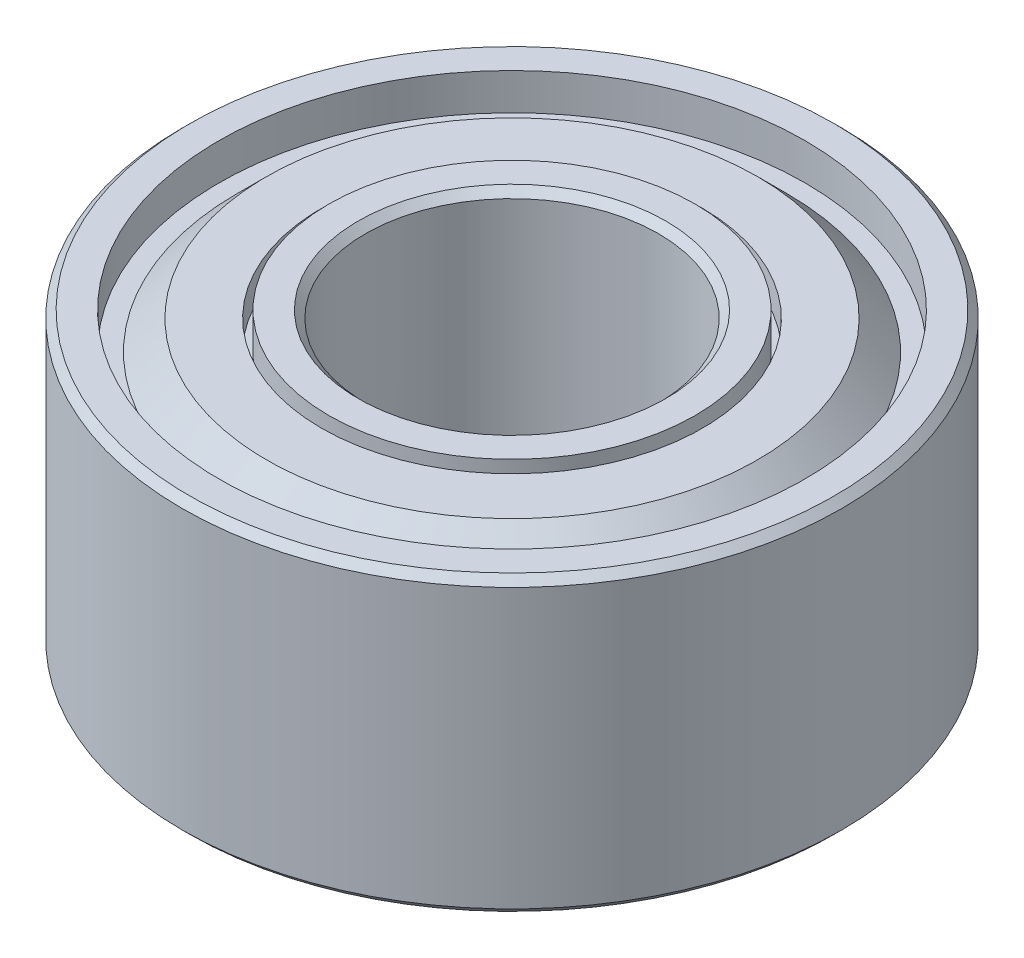
ISO-10303-21;
HEADER;
FILE_DESCRIPTION(('STEP AP214'),'2;1');
FILE_NAME('part.step','',(''),(''),'','','');
FILE_SCHEMA(('AUTOMOTIVE_DESIGN { 1 0 10303 214 1 1 1 1 }'));
ENDSEC;
DATA;
#1=APPLICATION_CONTEXT('core data for automotive mechanical design processes');
#2=APPLICATION_PROTOCOL_DEFINITION('international standard','automotive_design',2000,#1);
#3=PRODUCT_CONTEXT('',#1,'mechanical');
#4=PRODUCT('Part','Part','',(#3));
#5=PRODUCT_RELATED_PRODUCT_CATEGORY('part','',(#4));
#6=PRODUCT_DEFINITION_FORMATION('','',#4);
#7=PRODUCT_DEFINITION_CONTEXT('part definition',#1,'design');
#8=PRODUCT_DEFINITION('design','',#6,#7);
#9=PRODUCT_DEFINITION_SHAPE('','',#8);
#10=(LENGTH_UNIT() NAMED_UNIT(*) SI_UNIT(.MILLI.,.METRE.));
#11=(NAMED_UNIT(*) PLANE_ANGLE_UNIT() SI_UNIT($,.RADIAN.));
#12=(NAMED_UNIT(*) SI_UNIT($,.STERADIAN.) SOLID_ANGLE_UNIT());
#13=UNCERTAINTY_MEASURE_WITH_UNIT(LENGTH_MEASURE(1.E-05),#10,'distance_accuracy_value','');
#14=(GEOMETRIC_REPRESENTATION_CONTEXT(3) GLOBAL_UNCERTAINTY_ASSIGNED_CONTEXT((#13)) GLOBAL_UNIT_ASSIGNED_CONTEXT((#10,
#11,#12)) REPRESENTATION_CONTEXT('',''));
#15=CARTESIAN_POINT('',(0.,0.,0.));
#16=DIRECTION('',(0.,0.,1.));
#17=DIRECTION('',(1.,0.,0.));
#18=AXIS2_PLACEMENT_3D('',#15,#16,#17);
#19=CARTESIAN_POINT('',(0.,2.,2.5));
#20=DIRECTION('',(0.,-1.,0.));
#21=DIRECTION('',(0.,0.,-1.));
#22=AXIS2_PLACEMENT_3D('',#19,#20,#21);
#23=PLANE('',#22);
#24=CARTESIAN_POINT('',(0.,2.,0.));
#25=DIRECTION('',(0.,-1.,0.));
#26=DIRECTION('',(0.,0.,-1.));
#27=AXIS2_PLACEMENT_3D('',#24,#25,#26);
#28=CIRCLE('',#27,2.1);
#29=CARTESIAN_POINT('',(0.,2.,-2.1));
#30=VERTEX_POINT('',#29);
#31=EDGE_CURVE('E54',#30,#30,#28,.T.);
#32=ORIENTED_EDGE('',*,*,#31,.T.);
#33=EDGE_LOOP('',(#32));
#34=FACE_BOUND('',#33,.T.);
#35=CARTESIAN_POINT('',(0.,2.,0.));
#36=DIRECTION('',(0.,-1.,0.));
#37=DIRECTION('',(0.,0.,-1.));
#38=AXIS2_PLACEMENT_3D('',#35,#36,#37);
#39=CIRCLE('',#38,2.5);
#40=CARTESIAN_POINT('',(0.,2.,-2.5));
#41=VERTEX_POINT('',#40);
#42=EDGE_CURVE('E111',#41,#41,#39,.T.);
#43=ORIENTED_EDGE('',*,*,#42,.F.);
#44=EDGE_LOOP('',(#43));
#45=FACE_BOUND('',#44,.T.);
#46=ADVANCED_FACE('F33',(#34,#45),#23,.F.);
#47=CARTESIAN_POINT('',(0.,-2.,0.));
#48=DIRECTION('',(0.,-1.,0.));
#49=DIRECTION('',(0.,0.,-1.));
#50=AXIS2_PLACEMENT_3D('',#47,#48,#49);
#51=CYLINDRICAL_SURFACE('',#50,2.);
#52=CARTESIAN_POINT('',(0.,-1.9,0.));
#53=DIRECTION('',(0.,1.,0.));
#54=DIRECTION('',(0.,0.,1.));
#55=AXIS2_PLACEMENT_3D('',#52,#53,#54);
#56=CIRCLE('',#55,2.);
#57=CARTESIAN_POINT('',(0.,-1.9,2.));
#58=VERTEX_POINT('',#57);
#59=EDGE_CURVE('E60',#58,#58,#56,.F.);
#60=ORIENTED_EDGE('',*,*,#59,.T.);
#61=EDGE_LOOP('',(#60));
#62=FACE_BOUND('',#61,.T.);
#63=CARTESIAN_POINT('',(0.,1.9,0.));
#64=DIRECTION('',(0.,-1.,0.));
#65=DIRECTION('',(0.,0.,-1.));
#66=AXIS2_PLACEMENT_3D('',#63,#64,#65);
#67=CIRCLE('',#66,2.);
#68=CARTESIAN_POINT('',(0.,1.9,-2.));
#69=VERTEX_POINT('',#68);
#70=EDGE_CURVE('E63',#69,#69,#67,.F.);
#71=ORIENTED_EDGE('',*,*,#70,.T.);
#72=EDGE_LOOP('',(#71));
#73=FACE_BOUND('',#72,.T.);
#74=ADVANCED_FACE('F118',(#62,#73),#51,.F.);
#75=CARTESIAN_POINT('',(0.,-2.,2.5));
#76=DIRECTION('',(0.,1.,0.));
#77=DIRECTION('',(0.,0.,1.));
#78=AXIS2_PLACEMENT_3D('',#75,#76,#77);
#79=PLANE('',#78);
#80=CARTESIAN_POINT('',(0.,-2.,0.));
#81=DIRECTION('',(0.,1.,0.));
#82=DIRECTION('',(0.,0.,1.));
#83=AXIS2_PLACEMENT_3D('',#80,#81,#82);
#84=CIRCLE('',#83,2.1);
#85=CARTESIAN_POINT('',(0.,-2.,2.1));
#86=VERTEX_POINT('',#85);
#87=EDGE_CURVE('E57',#86,#86,#84,.T.);
#88=ORIENTED_EDGE('',*,*,#87,.T.);
#89=EDGE_LOOP('',(#88));
#90=FACE_BOUND('',#89,.T.);
#91=CARTESIAN_POINT('',(0.,-2.,0.));
#92=DIRECTION('',(0.,-1.,0.));
#93=DIRECTION('',(0.,0.,-1.));
#94=AXIS2_PLACEMENT_3D('',#91,#92,#93);
#95=CIRCLE('',#94,2.5);
#96=CARTESIAN_POINT('',(0.,-2.,-2.5));
#97=VERTEX_POINT('',#96);
#98=EDGE_CURVE('E66',#97,#97,#95,.T.);
#99=ORIENTED_EDGE('',*,*,#98,.T.);
#100=EDGE_LOOP('',(#99));
#101=FACE_BOUND('',#100,.T.);
#102=ADVANCED_FACE('F124',(#90,#101),#79,.F.);
#103=CARTESIAN_POINT('',(0.,-2.,0.));
#104=DIRECTION('',(0.,-1.,0.));
#105=DIRECTION('',(0.,0.,-1.));
#106=AXIS2_PLACEMENT_3D('',#103,#104,#105);
#107=CYLINDRICAL_SURFACE('',#106,2.5);
#108=ORIENTED_EDGE('',*,*,#98,.F.);
#109=EDGE_LOOP('',(#108));
#110=FACE_BOUND('',#109,.T.);
#111=CARTESIAN_POINT('',(0.,-1.5,0.));
#112=DIRECTION('',(0.,-1.,0.));
#113=DIRECTION('',(0.,0.,-1.));
#114=AXIS2_PLACEMENT_3D('',#111,#112,#113);
#115=CIRCLE('',#114,2.5);
#116=CARTESIAN_POINT('',(0.,-1.5,-2.5));
#117=VERTEX_POINT('',#116);
#118=EDGE_CURVE('E69',#117,#117,#115,.T.);
#119=ORIENTED_EDGE('',*,*,#118,.T.);
#120=EDGE_LOOP('',(#119));
#121=FACE_BOUND('',#120,.T.);
#122=ADVANCED_FACE('F190',(#110,#121),#107,.T.);
#123=CARTESIAN_POINT('',(0.,-1.5,2.6));
#124=DIRECTION('',(0.,1.,0.));
#125=DIRECTION('',(0.,0.,1.));
#126=AXIS2_PLACEMENT_3D('',#123,#124,#125);
#127=PLANE('',#126);
#128=ORIENTED_EDGE('',*,*,#118,.F.);
#129=EDGE_LOOP('',(#128));
#130=FACE_BOUND('',#129,.T.);
#131=CARTESIAN_POINT('',(0.,-1.5,0.));
#132=DIRECTION('',(0.,-1.,0.));
#133=DIRECTION('',(0.,0.,-1.));
#134=AXIS2_PLACEMENT_3D('',#131,#132,#133);
#135=CIRCLE('',#134,2.6);
#136=CARTESIAN_POINT('',(0.,-1.5,-2.6));
#137=VERTEX_POINT('',#136);
#138=EDGE_CURVE('E72',#137,#137,#135,.T.);
#139=ORIENTED_EDGE('',*,*,#138,.T.);
#140=EDGE_LOOP('',(#139));
#141=FACE_BOUND('',#140,.T.);
#142=ADVANCED_FACE('F186',(#130,#141),#127,.F.);
#143=CARTESIAN_POINT('',(0.,-2.,0.));
#144=DIRECTION('',(0.,-1.,0.));
#145=DIRECTION('',(0.,0.,-1.));
#146=AXIS2_PLACEMENT_3D('',#143,#144,#145);
#147=CYLINDRICAL_SURFACE('',#146,2.6);
#148=ORIENTED_EDGE('',*,*,#138,.F.);
#149=EDGE_LOOP('',(#148));
#150=FACE_BOUND('',#149,.T.);
#151=CARTESIAN_POINT('',(0.,-1.9,0.));
#152=DIRECTION('',(0.,-1.,0.));
#153=DIRECTION('',(0.,0.,-1.));
#154=AXIS2_PLACEMENT_3D('',#151,#152,#153);
#155=CIRCLE('',#154,2.6);
#156=CARTESIAN_POINT('',(0.,-1.9,-2.6));
#157=VERTEX_POINT('',#156);
#158=EDGE_CURVE('E75',#157,#157,#155,.T.);
#159=ORIENTED_EDGE('',*,*,#158,.T.);
#160=EDGE_LOOP('',(#159));
#161=FACE_BOUND('',#160,.T.);
#162=ADVANCED_FACE('F182',(#150,#161),#147,.F.);
#163=CARTESIAN_POINT('',(0.,-1.9,3.35));
#164=DIRECTION('',(0.,1.,0.));
#165=DIRECTION('',(0.,0.,1.));
#166=AXIS2_PLACEMENT_3D('',#163,#164,#165);
#167=PLANE('',#166);
#168=ORIENTED_EDGE('',*,*,#158,.F.);
#169=EDGE_LOOP('',(#168));
#170=FACE_BOUND('',#169,.T.);
#171=CARTESIAN_POINT('',(0.,-1.9,0.));
#172=DIRECTION('',(0.,-1.,0.));
#173=DIRECTION('',(0.,0.,-1.));
#174=AXIS2_PLACEMENT_3D('',#171,#172,#173);
#175=CIRCLE('',#174,3.35);
#176=CARTESIAN_POINT('',(0.,-1.9,-3.35));
#177=VERTEX_POINT('',#176);
#178=EDGE_CURVE('E78',#177,#177,#175,.T.);
#179=ORIENTED_EDGE('',*,*,#178,.T.);
#180=EDGE_LOOP('',(#179));
#181=FACE_BOUND('',#180,.T.);
#182=ADVANCED_FACE('F178',(#170,#181),#167,.F.);
#183=CARTESIAN_POINT('',(0.,-1.5,0.));
#184=DIRECTION('',(0.,1.,0.));
#185=DIRECTION('',(0.,0.,1.));
#186=AXIS2_PLACEMENT_3D('',#183,#184,#185);
#187=CONICAL_SURFACE('',#186,3.75,0.785398163397443);
#188=ORIENTED_EDGE('',*,*,#178,.F.);
#189=EDGE_LOOP('',(#188));
#190=FACE_BOUND('',#189,.T.);
#191=CARTESIAN_POINT('',(0.,-1.5,0.));
#192=DIRECTION('',(0.,-1.,0.));
#193=DIRECTION('',(0.,0.,-1.));
#194=AXIS2_PLACEMENT_3D('',#191,#192,#193);
#195=CIRCLE('',#194,3.75);
#196=CARTESIAN_POINT('',(0.,-1.5,-3.75));
#197=VERTEX_POINT('',#196);
#198=EDGE_CURVE('E81',#197,#197,#195,.T.);
#199=ORIENTED_EDGE('',*,*,#198,.T.);
#200=EDGE_LOOP('',(#199));
#201=FACE_BOUND('',#200,.T.);
#202=ADVANCED_FACE('F170',(#190,#201),#187,.T.);
#203=CARTESIAN_POINT('',(0.,-1.5,4.));
#204=DIRECTION('',(0.,1.,0.));
#205=DIRECTION('',(0.,0.,1.));
#206=AXIS2_PLACEMENT_3D('',#203,#204,#205);
#207=PLANE('',#206);
#208=ORIENTED_EDGE('',*,*,#198,.F.);
#209=EDGE_LOOP('',(#208));
#210=FACE_BOUND('',#209,.T.);
#211=CARTESIAN_POINT('',(0.,-1.5,0.));
#212=DIRECTION('',(0.,-1.,0.));
#213=DIRECTION('',(0.,0.,-1.));
#214=AXIS2_PLACEMENT_3D('',#211,#212,#213);
#215=CIRCLE('',#214,4.);
#216=CARTESIAN_POINT('',(0.,-1.5,-4.));
#217=VERTEX_POINT('',#216);
#218=EDGE_CURVE('E84',#217,#217,#215,.T.);
#219=ORIENTED_EDGE('',*,*,#218,.T.);
#220=EDGE_LOOP('',(#219));
#221=FACE_BOUND('',#220,.T.);
#222=ADVANCED_FACE('F164',(#210,#221),#207,.F.);
#223=CARTESIAN_POINT('',(0.,-2.,0.));
#224=DIRECTION('',(0.,-1.,0.));
#225=DIRECTION('',(0.,0.,-1.));
#226=AXIS2_PLACEMENT_3D('',#223,#224,#225);
#227=CYLINDRICAL_SURFACE('',#226,4.);
#228=ORIENTED_EDGE('',*,*,#218,.F.);
#229=EDGE_LOOP('',(#228));
#230=FACE_BOUND('',#229,.T.);
#231=CARTESIAN_POINT('',(0.,-2.,0.));
#232=DIRECTION('',(0.,-1.,0.));
#233=DIRECTION('',(0.,0.,-1.));
#234=AXIS2_PLACEMENT_3D('',#231,#232,#233);
#235=CIRCLE('',#234,4.);
#236=CARTESIAN_POINT('',(0.,-2.,-4.));
#237=VERTEX_POINT('',#236);
#238=EDGE_CURVE('E87',#237,#237,#235,.T.);
#239=ORIENTED_EDGE('',*,*,#238,.T.);
#240=EDGE_LOOP('',(#239));
#241=FACE_BOUND('',#240,.T.);
#242=ADVANCED_FACE('F159',(#230,#241),#227,.F.);
#243=CARTESIAN_POINT('',(0.,-2.,4.5));
#244=DIRECTION('',(0.,1.,0.));
#245=DIRECTION('',(0.,0.,1.));
#246=AXIS2_PLACEMENT_3D('',#243,#244,#245);
#247=PLANE('',#246);
#248=CARTESIAN_POINT('',(0.,-2.,0.));
#249=DIRECTION('',(0.,1.,0.));
#250=DIRECTION('',(0.,0.,1.));
#251=AXIS2_PLACEMENT_3D('',#248,#249,#250);
#252=CIRCLE('',#251,4.4);
#253=CARTESIAN_POINT('',(0.,-2.,4.4));
#254=VERTEX_POINT('',#253);
#255=EDGE_CURVE('E49',#254,#254,#252,.F.);
#256=ORIENTED_EDGE('',*,*,#255,.T.);
#257=EDGE_LOOP('',(#256));
#258=FACE_BOUND('',#257,.T.);
#259=ORIENTED_EDGE('',*,*,#238,.F.);
#260=EDGE_LOOP('',(#259));
#261=FACE_BOUND('',#260,.T.);
#262=ADVANCED_FACE('F155',(#258,#261),#247,.F.);
#263=CARTESIAN_POINT('',(0.,-2.,0.));
#264=DIRECTION('',(0.,-1.,0.));
#265=DIRECTION('',(0.,0.,-1.));
#266=AXIS2_PLACEMENT_3D('',#263,#264,#265);
#267=CYLINDRICAL_SURFACE('',#266,4.5);
#268=CARTESIAN_POINT('',(0.,-1.9,0.));
#269=DIRECTION('',(0.,1.,0.));
#270=DIRECTION('',(0.,0.,1.));
#271=AXIS2_PLACEMENT_3D('',#268,#269,#270);
#272=CIRCLE('',#271,4.5);
#273=CARTESIAN_POINT('',(0.,-1.9,4.5));
#274=VERTEX_POINT('',#273);
#275=EDGE_CURVE('E41',#274,#274,#272,.T.);
#276=ORIENTED_EDGE('',*,*,#275,.T.);
#277=EDGE_LOOP('',(#276));
#278=FACE_BOUND('',#277,.T.);
#279=CARTESIAN_POINT('',(0.,1.9,0.));
#280=DIRECTION('',(0.,-1.,0.));
#281=DIRECTION('',(0.,0.,-1.));
#282=AXIS2_PLACEMENT_3D('',#279,#280,#281);
#283=CIRCLE('',#282,4.5);
#284=CARTESIAN_POINT('',(0.,1.9,-4.5));
#285=VERTEX_POINT('',#284);
#286=EDGE_CURVE('E45',#285,#285,#283,.T.);
#287=ORIENTED_EDGE('',*,*,#286,.T.);
#288=EDGE_LOOP('',(#287));
#289=FACE_BOUND('',#288,.T.);
#290=ADVANCED_FACE('F158',(#278,#289),#267,.T.);
#291=CARTESIAN_POINT('',(0.,2.,4.5));
#292=DIRECTION('',(0.,-1.,0.));
#293=DIRECTION('',(0.,0.,-1.));
#294=AXIS2_PLACEMENT_3D('',#291,#292,#293);
#295=PLANE('',#294);
#296=CARTESIAN_POINT('',(0.,2.,0.));
#297=DIRECTION('',(0.,-1.,0.));
#298=DIRECTION('',(0.,0.,-1.));
#299=AXIS2_PLACEMENT_3D('',#296,#297,#298);
#300=CIRCLE('',#299,4.4);
#301=CARTESIAN_POINT('',(0.,2.,-4.4));
#302=VERTEX_POINT('',#301);
#303=EDGE_CURVE('E10',#302,#302,#300,.F.);
#304=ORIENTED_EDGE('',*,*,#303,.T.);
#305=EDGE_LOOP('',(#304));
#306=FACE_BOUND('',#305,.T.);
#307=CARTESIAN_POINT('',(0.,2.,0.));
#308=DIRECTION('',(0.,-1.,0.));
#309=DIRECTION('',(0.,0.,-1.));
#310=AXIS2_PLACEMENT_3D('',#307,#308,#309);
#311=CIRCLE('',#310,4.);
#312=CARTESIAN_POINT('',(0.,2.,-4.));
#313=VERTEX_POINT('',#312);
#314=EDGE_CURVE('E90',#313,#313,#311,.T.);
#315=ORIENTED_EDGE('',*,*,#314,.T.);
#316=EDGE_LOOP('',(#315));
#317=FACE_BOUND('',#316,.T.);
#318=ADVANCED_FACE('F261',(#306,#317),#295,.F.);
#319=CARTESIAN_POINT('',(0.,-2.,0.));
#320=DIRECTION('',(0.,-1.,0.));
#321=DIRECTION('',(0.,0.,-1.));
#322=AXIS2_PLACEMENT_3D('',#319,#320,#321);
#323=CYLINDRICAL_SURFACE('',#322,4.);
#324=ORIENTED_EDGE('',*,*,#314,.F.);
#325=EDGE_LOOP('',(#324));
#326=FACE_BOUND('',#325,.T.);
#327=CARTESIAN_POINT('',(0.,1.5,0.));
#328=DIRECTION('',(0.,-1.,0.));
#329=DIRECTION('',(0.,0.,-1.));
#330=AXIS2_PLACEMENT_3D('',#327,#328,#329);
#331=CIRCLE('',#330,4.);
#332=CARTESIAN_POINT('',(0.,1.5,-4.));
#333=VERTEX_POINT('',#332);
#334=EDGE_CURVE('E93',#333,#333,#331,.T.);
#335=ORIENTED_EDGE('',*,*,#334,.T.);
#336=EDGE_LOOP('',(#335));
#337=FACE_BOUND('',#336,.T.);
#338=ADVANCED_FACE('F255',(#326,#337),#323,.F.);
#339=CARTESIAN_POINT('',(0.,1.5,4.));
#340=DIRECTION('',(0.,-1.,0.));
#341=DIRECTION('',(0.,0.,-1.));
#342=AXIS2_PLACEMENT_3D('',#339,#340,#341);
#343=PLANE('',#342);
#344=ORIENTED_EDGE('',*,*,#334,.F.);
#345=EDGE_LOOP('',(#344));
#346=FACE_BOUND('',#345,.T.);
#347=CARTESIAN_POINT('',(0.,1.5,0.));
#348=DIRECTION('',(0.,-1.,0.));
#349=DIRECTION('',(0.,0.,-1.));
#350=AXIS2_PLACEMENT_3D('',#347,#348,#349);
#351=CIRCLE('',#350,3.75);
#352=CARTESIAN_POINT('',(0.,1.5,-3.75));
#353=VERTEX_POINT('',#352);
#354=EDGE_CURVE('E96',#353,#353,#351,.T.);
#355=ORIENTED_EDGE('',*,*,#354,.T.);
#356=EDGE_LOOP('',(#355));
#357=FACE_BOUND('',#356,.T.);
#358=ADVANCED_FACE('F260',(#346,#357),#343,.F.);
#359=CARTESIAN_POINT('',(0.,1.9,0.));
#360=DIRECTION('',(0.,-1.,0.));
#361=DIRECTION('',(0.,0.,-1.));
#362=AXIS2_PLACEMENT_3D('',#359,#360,#361);
#363=CONICAL_SURFACE('',#362,3.35,0.785398163397442);
#364=ORIENTED_EDGE('',*,*,#354,.F.);
#365=EDGE_LOOP('',(#364));
#366=FACE_BOUND('',#365,.T.);
#367=CARTESIAN_POINT('',(0.,1.9,0.));
#368=DIRECTION('',(0.,-1.,0.));
#369=DIRECTION('',(0.,0.,-1.));
#370=AXIS2_PLACEMENT_3D('',#367,#368,#369);
#371=CIRCLE('',#370,3.35);
#372=CARTESIAN_POINT('',(0.,1.9,-3.35));
#373=VERTEX_POINT('',#372);
#374=EDGE_CURVE('E99',#373,#373,#371,.T.);
#375=ORIENTED_EDGE('',*,*,#374,.T.);
#376=EDGE_LOOP('',(#375));
#377=FACE_BOUND('',#376,.T.);
#378=ADVANCED_FACE('F273',(#366,#377),#363,.T.);
#379=CARTESIAN_POINT('',(0.,1.9,3.35));
#380=DIRECTION('',(0.,-1.,0.));
#381=DIRECTION('',(0.,0.,-1.));
#382=AXIS2_PLACEMENT_3D('',#379,#380,#381);
#383=PLANE('',#382);
#384=ORIENTED_EDGE('',*,*,#374,.F.);
#385=EDGE_LOOP('',(#384));
#386=FACE_BOUND('',#385,.T.);
#387=CARTESIAN_POINT('',(0.,1.9,0.));
#388=DIRECTION('',(0.,-1.,0.));
#389=DIRECTION('',(0.,0.,-1.));
#390=AXIS2_PLACEMENT_3D('',#387,#388,#389);
#391=CIRCLE('',#390,2.6);
#392=CARTESIAN_POINT('',(0.,1.9,-2.6));
#393=VERTEX_POINT('',#392);
#394=EDGE_CURVE('E102',#393,#393,#391,.T.);
#395=ORIENTED_EDGE('',*,*,#394,.T.);
#396=EDGE_LOOP('',(#395));
#397=FACE_BOUND('',#396,.T.);
#398=ADVANCED_FACE('F283',(#386,#397),#383,.F.);
#399=CARTESIAN_POINT('',(0.,-2.,0.));
#400=DIRECTION('',(0.,-1.,0.));
#401=DIRECTION('',(0.,0.,-1.));
#402=AXIS2_PLACEMENT_3D('',#399,#400,#401);
#403=CYLINDRICAL_SURFACE('',#402,2.6);
#404=ORIENTED_EDGE('',*,*,#394,.F.);
#405=EDGE_LOOP('',(#404));
#406=FACE_BOUND('',#405,.T.);
#407=CARTESIAN_POINT('',(0.,1.5,0.));
#408=DIRECTION('',(0.,-1.,0.));
#409=DIRECTION('',(0.,0.,-1.));
#410=AXIS2_PLACEMENT_3D('',#407,#408,#409);
#411=CIRCLE('',#410,2.6);
#412=CARTESIAN_POINT('',(0.,1.5,-2.6));
#413=VERTEX_POINT('',#412);
#414=EDGE_CURVE('E105',#413,#413,#411,.T.);
#415=ORIENTED_EDGE('',*,*,#414,.T.);
#416=EDGE_LOOP('',(#415));
#417=FACE_BOUND('',#416,.T.);
#418=ADVANCED_FACE('F293',(#406,#417),#403,.F.);
#419=CARTESIAN_POINT('',(0.,1.5,2.6));
#420=DIRECTION('',(0.,-1.,0.));
#421=DIRECTION('',(0.,0.,-1.));
#422=AXIS2_PLACEMENT_3D('',#419,#420,#421);
#423=PLANE('',#422);
#424=ORIENTED_EDGE('',*,*,#414,.F.);
#425=EDGE_LOOP('',(#424));
#426=FACE_BOUND('',#425,.T.);
#427=CARTESIAN_POINT('',(0.,1.5,0.));
#428=DIRECTION('',(0.,-1.,0.));
#429=DIRECTION('',(0.,0.,-1.));
#430=AXIS2_PLACEMENT_3D('',#427,#428,#429);
#431=CIRCLE('',#430,2.5);
#432=CARTESIAN_POINT('',(0.,1.5,-2.5));
#433=VERTEX_POINT('',#432);
#434=EDGE_CURVE('E108',#433,#433,#431,.T.);
#435=ORIENTED_EDGE('',*,*,#434,.T.);
#436=EDGE_LOOP('',(#435));
#437=FACE_BOUND('',#436,.T.);
#438=ADVANCED_FACE('F303',(#426,#437),#423,.F.);
#439=CARTESIAN_POINT('',(0.,-2.,0.));
#440=DIRECTION('',(0.,-1.,0.));
#441=DIRECTION('',(0.,0.,-1.));
#442=AXIS2_PLACEMENT_3D('',#439,#440,#441);
#443=CYLINDRICAL_SURFACE('',#442,2.5);
#444=ORIENTED_EDGE('',*,*,#434,.F.);
#445=EDGE_LOOP('',(#444));
#446=FACE_BOUND('',#445,.T.);
#447=ORIENTED_EDGE('',*,*,#42,.T.);
#448=EDGE_LOOP('',(#447));
#449=FACE_BOUND('',#448,.T.);
#450=ADVANCED_FACE('F115',(#446,#449),#443,.T.);
#451=CARTESIAN_POINT('',(0.,-1.9,0.));
#452=DIRECTION('',(0.,-1.,0.));
#453=DIRECTION('',(0.,0.,-1.));
#454=AXIS2_PLACEMENT_3D('',#451,#452,#453);
#455=CONICAL_SURFACE('',#454,2.,0.785398163397456);
#456=ORIENTED_EDGE('',*,*,#87,.F.);
#457=EDGE_LOOP('',(#456));
#458=FACE_BOUND('',#457,.T.);
#459=ORIENTED_EDGE('',*,*,#59,.F.);
#460=EDGE_LOOP('',(#459));
#461=FACE_BOUND('',#460,.T.);
#462=ADVANCED_FACE('F130',(#458,#461),#455,.F.);
#463=CARTESIAN_POINT('',(0.,2.,0.));
#464=DIRECTION('',(0.,1.,0.));
#465=DIRECTION('',(0.,0.,1.));
#466=AXIS2_PLACEMENT_3D('',#463,#464,#465);
#467=CONICAL_SURFACE('',#466,2.1,0.785398163397446);
#468=ORIENTED_EDGE('',*,*,#70,.F.);
#469=EDGE_LOOP('',(#468));
#470=FACE_BOUND('',#469,.T.);
#471=ORIENTED_EDGE('',*,*,#31,.F.);
#472=EDGE_LOOP('',(#471));
#473=FACE_BOUND('',#472,.T.);
#474=ADVANCED_FACE('F136',(#470,#473),#467,.F.);
#475=CARTESIAN_POINT('',(0.,-2.,0.));
#476=DIRECTION('',(0.,1.,0.));
#477=DIRECTION('',(0.,0.,1.));
#478=AXIS2_PLACEMENT_3D('',#475,#476,#477);
#479=CONICAL_SURFACE('',#478,4.4,0.785398163397447);
#480=ORIENTED_EDGE('',*,*,#275,.F.);
#481=EDGE_LOOP('',(#480));
#482=FACE_BOUND('',#481,.T.);
#483=ORIENTED_EDGE('',*,*,#255,.F.);
#484=EDGE_LOOP('',(#483));
#485=FACE_BOUND('',#484,.T.);
#486=ADVANCED_FACE('F142',(#482,#485),#479,.T.);
#487=CARTESIAN_POINT('',(0.,1.9,0.));
#488=DIRECTION('',(0.,-1.,0.));
#489=DIRECTION('',(0.,0.,-1.));
#490=AXIS2_PLACEMENT_3D('',#487,#488,#489);
#491=CONICAL_SURFACE('',#490,4.5,0.785398163397444);
#492=ORIENTED_EDGE('',*,*,#303,.F.);
#493=EDGE_LOOP('',(#492));
#494=FACE_BOUND('',#493,.T.);
#495=ORIENTED_EDGE('',*,*,#286,.F.);
#496=EDGE_LOOP('',(#495));
#497=FACE_BOUND('',#496,.T.);
#498=ADVANCED_FACE('F36',(#494,#497),#491,.T.);
#499=CLOSED_SHELL('',(#46,#74,#102,#122,#142,#162,#182,#202,#222,#242,#262,#290,#318,#338,#358,
#378,#398,#418,#438,#450,#462,#474,#486,#498));
#500=MANIFOLD_SOLID_BREP('B2',#499);
#501=ADVANCED_BREP_SHAPE_REPRESENTATION('',(#18,#500),#14);
#502=SHAPE_DEFINITION_REPRESENTATION(#9,#501);
ENDSEC;
END-ISO-10303-21;
